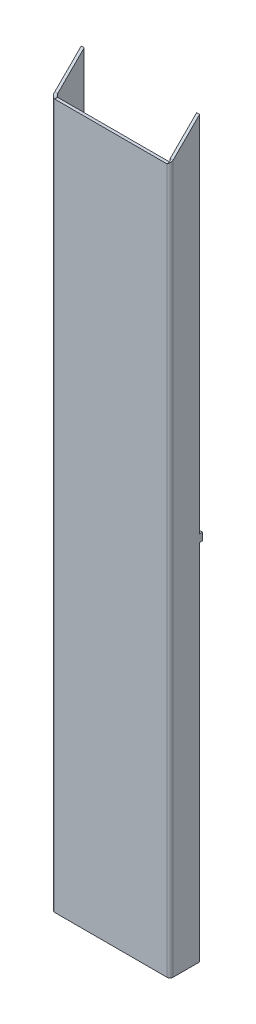
ISO-10303-21;
HEADER;
FILE_DESCRIPTION(('STEP AP214'),'2;1');
FILE_NAME('part.step','',(''),(''),'','','');
FILE_SCHEMA(('AUTOMOTIVE_DESIGN { 1 0 10303 214 1 1 1 1 }'));
ENDSEC;
DATA;
#1=APPLICATION_CONTEXT('core data for automotive mechanical design processes');
#2=APPLICATION_PROTOCOL_DEFINITION('international standard','automotive_design',2000,#1);
#3=PRODUCT_CONTEXT('',#1,'mechanical');
#4=PRODUCT('Part','Part','',(#3));
#5=PRODUCT_RELATED_PRODUCT_CATEGORY('part','',(#4));
#6=PRODUCT_DEFINITION_FORMATION('','',#4);
#7=PRODUCT_DEFINITION_CONTEXT('part definition',#1,'design');
#8=PRODUCT_DEFINITION('design','',#6,#7);
#9=PRODUCT_DEFINITION_SHAPE('','',#8);
#10=(LENGTH_UNIT() NAMED_UNIT(*) SI_UNIT(.MILLI.,.METRE.));
#11=(NAMED_UNIT(*) PLANE_ANGLE_UNIT() SI_UNIT($,.RADIAN.));
#12=(NAMED_UNIT(*) SI_UNIT($,.STERADIAN.) SOLID_ANGLE_UNIT());
#13=UNCERTAINTY_MEASURE_WITH_UNIT(LENGTH_MEASURE(1.E-05),#10,'distance_accuracy_value','');
#14=(GEOMETRIC_REPRESENTATION_CONTEXT(3) GLOBAL_UNCERTAINTY_ASSIGNED_CONTEXT((#13)) GLOBAL_UNIT_ASSIGNED_CONTEXT((#10,
#11,#12)) REPRESENTATION_CONTEXT('',''));
#15=CARTESIAN_POINT('',(0.,0.,0.));
#16=DIRECTION('',(0.,0.,1.));
#17=DIRECTION('',(1.,0.,0.));
#18=AXIS2_PLACEMENT_3D('',#15,#16,#17);
#19=CARTESIAN_POINT('',(1202.79808621894,247.5,-148.));
#20=DIRECTION('',(0.,-1.,0.));
#21=DIRECTION('',(1.,0.,0.));
#22=AXIS2_PLACEMENT_3D('',#19,#20,#21);
#23=PLANE('',#22);
#24=DIRECTION('',(-1.,0.,0.));
#25=VECTOR('',#24,1.);
#26=CARTESIAN_POINT('',(1202.79808621894,247.5,-148.));
#27=LINE('',#26,#25);
#28=CARTESIAN_POINT('',(212.,247.5,-148.));
#29=VERTEX_POINT('',#28);
#30=CARTESIAN_POINT('',(210.,247.5,-148.));
#31=VERTEX_POINT('',#30);
#32=EDGE_CURVE('E248',#29,#31,#27,.T.);
#33=ORIENTED_EDGE('',*,*,#32,.T.);
#34=DIRECTION('',(0.,0.,1.));
#35=VECTOR('',#34,1.);
#36=CARTESIAN_POINT('',(210.,247.5,-148.));
#37=LINE('',#36,#35);
#38=CARTESIAN_POINT('',(210.,247.5,-150.));
#39=VERTEX_POINT('',#38);
#40=EDGE_CURVE('E112',#39,#31,#37,.T.);
#41=ORIENTED_EDGE('',*,*,#40,.F.);
#42=DIRECTION('',(-1.,0.,0.));
#43=VECTOR('',#42,1.);
#44=CARTESIAN_POINT('',(1202.79808621894,247.5,-150.));
#45=LINE('',#44,#43);
#46=CARTESIAN_POINT('',(212.,247.5,-150.));
#47=VERTEX_POINT('',#46);
#48=EDGE_CURVE('E626',#47,#39,#45,.T.);
#49=ORIENTED_EDGE('',*,*,#48,.F.);
#50=DIRECTION('',(0.,0.,1.));
#51=VECTOR('',#50,1.);
#52=CARTESIAN_POINT('',(212.,247.5,-148.));
#53=LINE('',#52,#51);
#54=EDGE_CURVE('E107',#47,#29,#53,.T.);
#55=ORIENTED_EDGE('',*,*,#54,.T.);
#56=EDGE_LOOP('',(#33,#41,#49,#55));
#57=FACE_BOUND('',#56,.T.);
#58=ADVANCED_FACE('F45',(#57),#23,.T.);
#59=CARTESIAN_POINT('',(1202.79808621894,252.5,-150.));
#60=DIRECTION('',(0.,0.,-1.));
#61=DIRECTION('',(-1.,0.,0.));
#62=AXIS2_PLACEMENT_3D('',#59,#60,#61);
#63=PLANE('',#62);
#64=ORIENTED_EDGE('',*,*,#48,.T.);
#65=DIRECTION('',(0.,-1.,0.));
#66=VECTOR('',#65,1.);
#67=CARTESIAN_POINT('',(210.,252.5,-150.));
#68=LINE('',#67,#66);
#69=CARTESIAN_POINT('',(210.,252.5,-150.));
#70=VERTEX_POINT('',#69);
#71=EDGE_CURVE('E638',#70,#39,#68,.T.);
#72=ORIENTED_EDGE('',*,*,#71,.F.);
#73=DIRECTION('',(-1.,0.,0.));
#74=VECTOR('',#73,1.);
#75=CARTESIAN_POINT('',(1202.79808621894,252.5,-150.));
#76=LINE('',#75,#74);
#77=CARTESIAN_POINT('',(212.,252.5,-150.));
#78=VERTEX_POINT('',#77);
#79=EDGE_CURVE('E620',#78,#70,#76,.T.);
#80=ORIENTED_EDGE('',*,*,#79,.F.);
#81=DIRECTION('',(0.,-1.,0.));
#82=VECTOR('',#81,1.);
#83=CARTESIAN_POINT('',(212.,252.5,-150.));
#84=LINE('',#83,#82);
#85=EDGE_CURVE('E623',#78,#47,#84,.T.);
#86=ORIENTED_EDGE('',*,*,#85,.T.);
#87=EDGE_LOOP('',(#64,#72,#80,#86));
#88=FACE_BOUND('',#87,.T.);
#89=ADVANCED_FACE('F573',(#88),#63,.T.);
#90=CARTESIAN_POINT('',(1202.79808621894,252.5,-148.));
#91=DIRECTION('',(0.,1.,0.));
#92=DIRECTION('',(-1.,0.,0.));
#93=AXIS2_PLACEMENT_3D('',#90,#91,#92);
#94=PLANE('',#93);
#95=ORIENTED_EDGE('',*,*,#79,.T.);
#96=DIRECTION('',(0.,0.,-1.));
#97=VECTOR('',#96,1.);
#98=CARTESIAN_POINT('',(210.,252.5,-148.));
#99=LINE('',#98,#97);
#100=CARTESIAN_POINT('',(210.,252.5,-148.));
#101=VERTEX_POINT('',#100);
#102=EDGE_CURVE('E631',#101,#70,#99,.T.);
#103=ORIENTED_EDGE('',*,*,#102,.F.);
#104=DIRECTION('',(-1.,0.,0.));
#105=VECTOR('',#104,1.);
#106=CARTESIAN_POINT('',(1202.79808621894,252.5,-148.));
#107=LINE('',#106,#105);
#108=CARTESIAN_POINT('',(212.,252.5,-148.));
#109=VERTEX_POINT('',#108);
#110=EDGE_CURVE('E621',#109,#101,#107,.T.);
#111=ORIENTED_EDGE('',*,*,#110,.F.);
#112=DIRECTION('',(0.,0.,-1.));
#113=VECTOR('',#112,1.);
#114=CARTESIAN_POINT('',(212.,252.5,-148.));
#115=LINE('',#114,#113);
#116=EDGE_CURVE('E615',#109,#78,#115,.T.);
#117=ORIENTED_EDGE('',*,*,#116,.T.);
#118=EDGE_LOOP('',(#95,#103,#111,#117));
#119=FACE_BOUND('',#118,.T.);
#120=ADVANCED_FACE('F577',(#119),#94,.T.);
#121=CARTESIAN_POINT('',(1202.79808621894,2.,-148.));
#122=DIRECTION('',(0.,0.,1.));
#123=DIRECTION('',(1.,0.,0.));
#124=AXIS2_PLACEMENT_3D('',#121,#122,#123);
#125=PLANE('',#124);
#126=DIRECTION('',(0.,1.,0.));
#127=VECTOR('',#126,1.);
#128=CARTESIAN_POINT('',(210.,2.,-148.));
#129=LINE('',#128,#127);
#130=CARTESIAN_POINT('',(210.,498.,-148.));
#131=VERTEX_POINT('',#130);
#132=EDGE_CURVE('E619',#101,#131,#129,.T.);
#133=ORIENTED_EDGE('',*,*,#132,.T.);
#134=DIRECTION('',(-1.,0.,0.));
#135=VECTOR('',#134,1.);
#136=CARTESIAN_POINT('',(1202.79808621894,498.,-148.));
#137=LINE('',#136,#135);
#138=CARTESIAN_POINT('',(212.,498.,-148.));
#139=VERTEX_POINT('',#138);
#140=EDGE_CURVE('E226',#139,#131,#137,.T.);
#141=ORIENTED_EDGE('',*,*,#140,.F.);
#142=DIRECTION('',(0.,1.,0.));
#143=VECTOR('',#142,1.);
#144=CARTESIAN_POINT('',(212.,2.,-148.));
#145=LINE('',#144,#143);
#146=EDGE_CURVE('E55',#109,#139,#145,.T.);
#147=ORIENTED_EDGE('',*,*,#146,.F.);
#148=ORIENTED_EDGE('',*,*,#110,.T.);
#149=EDGE_LOOP('',(#133,#141,#147,#148));
#150=FACE_BOUND('',#149,.T.);
#151=ADVANCED_FACE('F583',(#150),#125,.F.);
#152=CARTESIAN_POINT('',(210.,2.,-148.));
#153=VERTEX_POINT('',#152);
#154=EDGE_CURVE('E222',#153,#31,#129,.T.);
#155=ORIENTED_EDGE('',*,*,#154,.T.);
#156=ORIENTED_EDGE('',*,*,#32,.F.);
#157=CARTESIAN_POINT('',(212.,2.,-148.));
#158=VERTEX_POINT('',#157);
#159=EDGE_CURVE('E283',#158,#29,#145,.T.);
#160=ORIENTED_EDGE('',*,*,#159,.F.);
#161=DIRECTION('',(-1.,0.,0.));
#162=VECTOR('',#161,1.);
#163=CARTESIAN_POINT('',(1202.79808621894,2.,-148.));
#164=LINE('',#163,#162);
#165=EDGE_CURVE('E237',#158,#153,#164,.T.);
#166=ORIENTED_EDGE('',*,*,#165,.T.);
#167=EDGE_LOOP('',(#155,#156,#160,#166));
#168=FACE_BOUND('',#167,.T.);
#169=ADVANCED_FACE('F585',(#168),#125,.F.);
#170=CARTESIAN_POINT('',(1202.79808621894,2.,-148.));
#171=DIRECTION('',(0.,1.,0.));
#172=DIRECTION('',(-1.,0.,0.));
#173=AXIS2_PLACEMENT_3D('',#170,#171,#172);
#174=PLANE('',#173);
#175=DIRECTION('',(0.,0.,1.));
#176=VECTOR('',#175,1.);
#177=CARTESIAN_POINT('',(210.,2.,-148.));
#178=LINE('',#177,#176);
#179=CARTESIAN_POINT('',(210.,2.,-130.1));
#180=VERTEX_POINT('',#179);
#181=EDGE_CURVE('E215',#153,#180,#178,.T.);
#182=ORIENTED_EDGE('',*,*,#181,.F.);
#183=ORIENTED_EDGE('',*,*,#165,.F.);
#184=DIRECTION('',(0.,0.,-1.));
#185=VECTOR('',#184,1.);
#186=CARTESIAN_POINT('',(212.,2.,-148.));
#187=LINE('',#186,#185);
#188=CARTESIAN_POINT('',(212.,2.,-130.1));
#189=VERTEX_POINT('',#188);
#190=EDGE_CURVE('E232',#189,#158,#187,.T.);
#191=ORIENTED_EDGE('',*,*,#190,.F.);
#192=DIRECTION('',(-1.,0.,0.));
#193=VECTOR('',#192,1.);
#194=CARTESIAN_POINT('',(1202.79808621894,2.,-130.1));
#195=LINE('',#194,#193);
#196=EDGE_CURVE('E229',#189,#180,#195,.T.);
#197=ORIENTED_EDGE('',*,*,#196,.T.);
#198=EDGE_LOOP('',(#182,#183,#191,#197));
#199=FACE_BOUND('',#198,.T.);
#200=ADVANCED_FACE('F230',(#199),#174,.F.);
#201=CARTESIAN_POINT('',(210.,2.,-148.));
#202=DIRECTION('',(-1.,0.,0.));
#203=DIRECTION('',(0.,0.,1.));
#204=AXIS2_PLACEMENT_3D('',#201,#202,#203);
#205=PLANE('',#204);
#206=DIRECTION('',(0.,-1.,0.));
#207=VECTOR('',#206,1.);
#208=CARTESIAN_POINT('',(210.,2.,-130.1));
#209=LINE('',#208,#207);
#210=CARTESIAN_POINT('',(210.,480.1,-130.1));
#211=VERTEX_POINT('',#210);
#212=EDGE_CURVE('E220',#211,#180,#209,.T.);
#213=ORIENTED_EDGE('',*,*,#212,.F.);
#214=DIRECTION('',(0.,0.707106781186548,-0.707106781186548));
#215=VECTOR('',#214,1.);
#216=CARTESIAN_POINT('',(210.,250.,100.));
#217=LINE('',#216,#215);
#218=EDGE_CURVE('E236',#211,#131,#217,.T.);
#219=ORIENTED_EDGE('',*,*,#218,.T.);
#220=ORIENTED_EDGE('',*,*,#132,.F.);
#221=ORIENTED_EDGE('',*,*,#102,.T.);
#222=ORIENTED_EDGE('',*,*,#71,.T.);
#223=ORIENTED_EDGE('',*,*,#40,.T.);
#224=ORIENTED_EDGE('',*,*,#154,.F.);
#225=ORIENTED_EDGE('',*,*,#181,.T.);
#226=EDGE_LOOP('',(#213,#219,#220,#221,#222,#223,#224,#225));
#227=FACE_BOUND('',#226,.T.);
#228=ADVANCED_FACE('F217',(#227),#205,.T.);
#229=CARTESIAN_POINT('',(1202.79808621894,250.,100.));
#230=DIRECTION('',(0.,-0.707106781186548,-0.707106781186548));
#231=DIRECTION('',(0.,-0.707106781186548,0.707106781186548));
#232=AXIS2_PLACEMENT_3D('',#229,#230,#231);
#233=PLANE('',#232);
#234=ORIENTED_EDGE('',*,*,#218,.F.);
#235=CARTESIAN_POINT('',(212.,480.1,-130.1));
#236=CARTESIAN_POINT('',(210.,480.1,-130.1));
#237=B_SPLINE_CURVE_WITH_KNOTS('',1,(#235,#236),.UNSPECIFIED.,.F.,.F.,(2,2),(0.,1.),.UNSPECIFIED.);
#238=CARTESIAN_POINT('',(212.,480.1,-130.1));
#239=VERTEX_POINT('',#238);
#240=EDGE_CURVE('E249',#239,#211,#237,.T.);
#241=ORIENTED_EDGE('',*,*,#240,.F.);
#242=DIRECTION('',(0.,-0.707106781186548,0.707106781186548));
#243=VECTOR('',#242,1.);
#244=CARTESIAN_POINT('',(212.,250.,100.));
#245=LINE('',#244,#243);
#246=EDGE_CURVE('E12',#139,#239,#245,.T.);
#247=ORIENTED_EDGE('',*,*,#246,.F.);
#248=ORIENTED_EDGE('',*,*,#140,.T.);
#249=EDGE_LOOP('',(#234,#241,#247,#248));
#250=FACE_BOUND('',#249,.T.);
#251=ADVANCED_FACE('F592',(#250),#233,.F.);
#252=CARTESIAN_POINT('',(212.,2.,-148.));
#253=DIRECTION('',(1.,0.,0.));
#254=DIRECTION('',(0.,0.,-1.));
#255=AXIS2_PLACEMENT_3D('',#252,#253,#254);
#256=PLANE('',#255);
#257=DIRECTION('',(0.,1.,0.));
#258=VECTOR('',#257,1.);
#259=CARTESIAN_POINT('',(212.,2.,-130.1));
#260=LINE('',#259,#258);
#261=EDGE_CURVE('E395',#189,#239,#260,.T.);
#262=ORIENTED_EDGE('',*,*,#261,.F.);
#263=ORIENTED_EDGE('',*,*,#190,.T.);
#264=ORIENTED_EDGE('',*,*,#159,.T.);
#265=ORIENTED_EDGE('',*,*,#54,.F.);
#266=ORIENTED_EDGE('',*,*,#85,.F.);
#267=ORIENTED_EDGE('',*,*,#116,.F.);
#268=ORIENTED_EDGE('',*,*,#146,.T.);
#269=ORIENTED_EDGE('',*,*,#246,.T.);
#270=EDGE_LOOP('',(#262,#263,#264,#265,#266,#267,#268,#269));
#271=FACE_BOUND('',#270,.T.);
#272=ADVANCED_FACE('F47',(#271),#256,.T.);
#273=CARTESIAN_POINT('',(-702.798086218945,252.5,-148.));
#274=DIRECTION('',(0.,1.,0.));
#275=DIRECTION('',(1.,0.,0.));
#276=AXIS2_PLACEMENT_3D('',#273,#274,#275);
#277=PLANE('',#276);
#278=DIRECTION('',(1.,0.,0.));
#279=VECTOR('',#278,1.);
#280=CARTESIAN_POINT('',(-702.798086218945,252.5,-148.));
#281=LINE('',#280,#279);
#282=CARTESIAN_POINT('',(288.,252.5,-148.));
#283=VERTEX_POINT('',#282);
#284=CARTESIAN_POINT('',(290.,252.5,-148.));
#285=VERTEX_POINT('',#284);
#286=EDGE_CURVE('E434',#283,#285,#281,.T.);
#287=ORIENTED_EDGE('',*,*,#286,.T.);
#288=DIRECTION('',(0.,0.,1.));
#289=VECTOR('',#288,1.);
#290=CARTESIAN_POINT('',(290.,252.5,-148.));
#291=LINE('',#290,#289);
#292=CARTESIAN_POINT('',(290.,252.5,-150.));
#293=VERTEX_POINT('',#292);
#294=EDGE_CURVE('E170',#293,#285,#291,.T.);
#295=ORIENTED_EDGE('',*,*,#294,.F.);
#296=DIRECTION('',(1.,0.,0.));
#297=VECTOR('',#296,1.);
#298=CARTESIAN_POINT('',(-702.798086218945,252.5,-150.));
#299=LINE('',#298,#297);
#300=CARTESIAN_POINT('',(288.,252.5,-150.));
#301=VERTEX_POINT('',#300);
#302=EDGE_CURVE('E430',#301,#293,#299,.T.);
#303=ORIENTED_EDGE('',*,*,#302,.F.);
#304=DIRECTION('',(0.,0.,1.));
#305=VECTOR('',#304,1.);
#306=CARTESIAN_POINT('',(288.,252.5,-148.));
#307=LINE('',#306,#305);
#308=EDGE_CURVE('E166',#301,#283,#307,.T.);
#309=ORIENTED_EDGE('',*,*,#308,.T.);
#310=EDGE_LOOP('',(#287,#295,#303,#309));
#311=FACE_BOUND('',#310,.T.);
#312=ADVANCED_FACE('F832',(#311),#277,.T.);
#313=CARTESIAN_POINT('',(-702.798086218945,252.5,-150.));
#314=DIRECTION('',(0.,0.,-1.));
#315=DIRECTION('',(-1.,0.,0.));
#316=AXIS2_PLACEMENT_3D('',#313,#314,#315);
#317=PLANE('',#316);
#318=ORIENTED_EDGE('',*,*,#302,.T.);
#319=DIRECTION('',(0.,1.,0.));
#320=VECTOR('',#319,1.);
#321=CARTESIAN_POINT('',(290.,252.5,-150.));
#322=LINE('',#321,#320);
#323=CARTESIAN_POINT('',(290.,247.5,-150.));
#324=VERTEX_POINT('',#323);
#325=EDGE_CURVE('E402',#324,#293,#322,.T.);
#326=ORIENTED_EDGE('',*,*,#325,.F.);
#327=DIRECTION('',(1.,0.,0.));
#328=VECTOR('',#327,1.);
#329=CARTESIAN_POINT('',(-702.798086218945,247.5,-150.));
#330=LINE('',#329,#328);
#331=CARTESIAN_POINT('',(288.,247.5,-150.));
#332=VERTEX_POINT('',#331);
#333=EDGE_CURVE('E419',#332,#324,#330,.T.);
#334=ORIENTED_EDGE('',*,*,#333,.F.);
#335=DIRECTION('',(0.,1.,0.));
#336=VECTOR('',#335,1.);
#337=CARTESIAN_POINT('',(288.,252.5,-150.));
#338=LINE('',#337,#336);
#339=EDGE_CURVE('E427',#332,#301,#338,.T.);
#340=ORIENTED_EDGE('',*,*,#339,.T.);
#341=EDGE_LOOP('',(#318,#326,#334,#340));
#342=FACE_BOUND('',#341,.T.);
#343=ADVANCED_FACE('F823',(#342),#317,.T.);
#344=CARTESIAN_POINT('',(-702.798086218945,247.5,-148.));
#345=DIRECTION('',(0.,-1.,0.));
#346=DIRECTION('',(-1.,0.,0.));
#347=AXIS2_PLACEMENT_3D('',#344,#345,#346);
#348=PLANE('',#347);
#349=ORIENTED_EDGE('',*,*,#333,.T.);
#350=DIRECTION('',(0.,0.,-1.));
#351=VECTOR('',#350,1.);
#352=CARTESIAN_POINT('',(290.,247.5,-148.));
#353=LINE('',#352,#351);
#354=CARTESIAN_POINT('',(290.,247.5,-148.));
#355=VERTEX_POINT('',#354);
#356=EDGE_CURVE('E372',#355,#324,#353,.T.);
#357=ORIENTED_EDGE('',*,*,#356,.F.);
#358=DIRECTION('',(1.,0.,0.));
#359=VECTOR('',#358,1.);
#360=CARTESIAN_POINT('',(-702.798086218945,247.5,-148.));
#361=LINE('',#360,#359);
#362=CARTESIAN_POINT('',(288.,247.5,-148.));
#363=VERTEX_POINT('',#362);
#364=EDGE_CURVE('E416',#363,#355,#361,.T.);
#365=ORIENTED_EDGE('',*,*,#364,.F.);
#366=DIRECTION('',(0.,0.,-1.));
#367=VECTOR('',#366,1.);
#368=CARTESIAN_POINT('',(288.,247.5,-148.));
#369=LINE('',#368,#367);
#370=EDGE_CURVE('E423',#363,#332,#369,.T.);
#371=ORIENTED_EDGE('',*,*,#370,.T.);
#372=EDGE_LOOP('',(#349,#357,#365,#371));
#373=FACE_BOUND('',#372,.T.);
#374=ADVANCED_FACE('F415',(#373),#348,.T.);
#375=CARTESIAN_POINT('',(-702.798086218945,2.,-148.));
#376=DIRECTION('',(0.,0.,-1.));
#377=DIRECTION('',(-1.,0.,0.));
#378=AXIS2_PLACEMENT_3D('',#375,#376,#377);
#379=PLANE('',#378);
#380=ORIENTED_EDGE('',*,*,#364,.T.);
#381=DIRECTION('',(0.,1.,0.));
#382=VECTOR('',#381,1.);
#383=CARTESIAN_POINT('',(290.,2.,-148.));
#384=LINE('',#383,#382);
#385=CARTESIAN_POINT('',(290.,2.,-148.));
#386=VERTEX_POINT('',#385);
#387=EDGE_CURVE('E370',#386,#355,#384,.T.);
#388=ORIENTED_EDGE('',*,*,#387,.F.);
#389=DIRECTION('',(1.,0.,0.));
#390=VECTOR('',#389,1.);
#391=CARTESIAN_POINT('',(-702.798086218945,2.,-148.));
#392=LINE('',#391,#390);
#393=CARTESIAN_POINT('',(288.,2.,-148.));
#394=VERTEX_POINT('',#393);
#395=EDGE_CURVE('E337',#394,#386,#392,.T.);
#396=ORIENTED_EDGE('',*,*,#395,.F.);
#397=DIRECTION('',(0.,1.,0.));
#398=VECTOR('',#397,1.);
#399=CARTESIAN_POINT('',(288.,2.,-148.));
#400=LINE('',#399,#398);
#401=EDGE_CURVE('E379',#394,#363,#400,.T.);
#402=ORIENTED_EDGE('',*,*,#401,.T.);
#403=EDGE_LOOP('',(#380,#388,#396,#402));
#404=FACE_BOUND('',#403,.T.);
#405=ADVANCED_FACE('F421',(#404),#379,.T.);
#406=DIRECTION('',(1.,0.,0.));
#407=VECTOR('',#406,1.);
#408=CARTESIAN_POINT('',(-702.798086218945,498.,-148.));
#409=LINE('',#408,#407);
#410=CARTESIAN_POINT('',(288.,498.,-148.));
#411=VERTEX_POINT('',#410);
#412=CARTESIAN_POINT('',(290.,498.,-148.));
#413=VERTEX_POINT('',#412);
#414=EDGE_CURVE('E378',#411,#413,#409,.T.);
#415=ORIENTED_EDGE('',*,*,#414,.T.);
#416=EDGE_CURVE('E338',#285,#413,#384,.T.);
#417=ORIENTED_EDGE('',*,*,#416,.F.);
#418=ORIENTED_EDGE('',*,*,#286,.F.);
#419=EDGE_CURVE('E375',#283,#411,#400,.T.);
#420=ORIENTED_EDGE('',*,*,#419,.T.);
#421=EDGE_LOOP('',(#415,#417,#418,#420));
#422=FACE_BOUND('',#421,.T.);
#423=ADVANCED_FACE('F798',(#422),#379,.T.);
#424=CARTESIAN_POINT('',(-702.798086218945,241.,109.));
#425=DIRECTION('',(0.,-0.707106781186548,-0.707106781186548));
#426=DIRECTION('',(0.,0.707106781186548,-0.707106781186548));
#427=AXIS2_PLACEMENT_3D('',#424,#425,#426);
#428=PLANE('',#427);
#429=DIRECTION('',(0.,-0.707106781186548,0.707106781186548));
#430=VECTOR('',#429,1.);
#431=CARTESIAN_POINT('',(290.,240.,110.));
#432=LINE('',#431,#430);
#433=CARTESIAN_POINT('',(290.,480.1,-130.1));
#434=VERTEX_POINT('',#433);
#435=EDGE_CURVE('E334',#413,#434,#432,.T.);
#436=ORIENTED_EDGE('',*,*,#435,.F.);
#437=ORIENTED_EDGE('',*,*,#414,.F.);
#438=DIRECTION('',(0.,0.707106781186548,-0.707106781186548));
#439=VECTOR('',#438,1.);
#440=CARTESIAN_POINT('',(288.,241.,109.));
#441=LINE('',#440,#439);
#442=CARTESIAN_POINT('',(288.,480.1,-130.1));
#443=VERTEX_POINT('',#442);
#444=EDGE_CURVE('E341',#443,#411,#441,.T.);
#445=ORIENTED_EDGE('',*,*,#444,.F.);
#446=CARTESIAN_POINT('',(290.,480.1,-130.099999999999));
#447=CARTESIAN_POINT('',(288.,480.1,-130.1));
#448=B_SPLINE_CURVE_WITH_KNOTS('',1,(#446,#447),.UNSPECIFIED.,.F.,.F.,(2,2),(0.,1.),.UNSPECIFIED.);
#449=EDGE_CURVE('E371',#443,#434,#448,.F.);
#450=ORIENTED_EDGE('',*,*,#449,.T.);
#451=EDGE_LOOP('',(#436,#437,#445,#450));
#452=FACE_BOUND('',#451,.T.);
#453=ADVANCED_FACE('F556',(#452),#428,.F.);
#454=CARTESIAN_POINT('',(290.,2.,-128.));
#455=DIRECTION('',(1.,0.,0.));
#456=DIRECTION('',(0.,0.,-1.));
#457=AXIS2_PLACEMENT_3D('',#454,#455,#456);
#458=PLANE('',#457);
#459=DIRECTION('',(0.,1.,0.));
#460=VECTOR('',#459,1.);
#461=CARTESIAN_POINT('',(290.,480.1,-130.1));
#462=LINE('',#461,#460);
#463=CARTESIAN_POINT('',(290.,2.,-130.1));
#464=VERTEX_POINT('',#463);
#465=EDGE_CURVE('E332',#464,#434,#462,.T.);
#466=ORIENTED_EDGE('',*,*,#465,.F.);
#467=DIRECTION('',(0.,0.,-1.));
#468=VECTOR('',#467,1.);
#469=CARTESIAN_POINT('',(290.,2.,-130.));
#470=LINE('',#469,#468);
#471=EDGE_CURVE('E365',#464,#386,#470,.T.);
#472=ORIENTED_EDGE('',*,*,#471,.T.);
#473=ORIENTED_EDGE('',*,*,#387,.T.);
#474=ORIENTED_EDGE('',*,*,#356,.T.);
#475=ORIENTED_EDGE('',*,*,#325,.T.);
#476=ORIENTED_EDGE('',*,*,#294,.T.);
#477=ORIENTED_EDGE('',*,*,#416,.T.);
#478=ORIENTED_EDGE('',*,*,#435,.T.);
#479=EDGE_LOOP('',(#466,#472,#473,#474,#475,#476,#477,#478));
#480=FACE_BOUND('',#479,.T.);
#481=ADVANCED_FACE('F409',(#480),#458,.T.);
#482=CARTESIAN_POINT('',(-702.798086218945,2.,-130.));
#483=DIRECTION('',(0.,1.,0.));
#484=DIRECTION('',(1.,0.,0.));
#485=AXIS2_PLACEMENT_3D('',#482,#483,#484);
#486=PLANE('',#485);
#487=ORIENTED_EDGE('',*,*,#471,.F.);
#488=DIRECTION('',(1.,0.,0.));
#489=VECTOR('',#488,1.);
#490=CARTESIAN_POINT('',(-702.798086218945,2.,-130.1));
#491=LINE('',#490,#489);
#492=CARTESIAN_POINT('',(288.,2.,-130.1));
#493=VERTEX_POINT('',#492);
#494=EDGE_CURVE('E435',#493,#464,#491,.T.);
#495=ORIENTED_EDGE('',*,*,#494,.F.);
#496=DIRECTION('',(0.,0.,1.));
#497=VECTOR('',#496,1.);
#498=CARTESIAN_POINT('',(288.,2.,-130.));
#499=LINE('',#498,#497);
#500=EDGE_CURVE('E121',#394,#493,#499,.T.);
#501=ORIENTED_EDGE('',*,*,#500,.F.);
#502=ORIENTED_EDGE('',*,*,#395,.T.);
#503=EDGE_LOOP('',(#487,#495,#501,#502));
#504=FACE_BOUND('',#503,.T.);
#505=ADVANCED_FACE('F563',(#504),#486,.F.);
#506=CARTESIAN_POINT('',(288.,2.,-130.));
#507=DIRECTION('',(-1.,0.,0.));
#508=DIRECTION('',(0.,0.,1.));
#509=AXIS2_PLACEMENT_3D('',#506,#507,#508);
#510=PLANE('',#509);
#511=DIRECTION('',(0.,-1.,0.));
#512=VECTOR('',#511,1.);
#513=CARTESIAN_POINT('',(288.,480.1,-130.1));
#514=LINE('',#513,#512);
#515=EDGE_CURVE('E315',#443,#493,#514,.T.);
#516=ORIENTED_EDGE('',*,*,#515,.F.);
#517=ORIENTED_EDGE('',*,*,#444,.T.);
#518=ORIENTED_EDGE('',*,*,#419,.F.);
#519=ORIENTED_EDGE('',*,*,#308,.F.);
#520=ORIENTED_EDGE('',*,*,#339,.F.);
#521=ORIENTED_EDGE('',*,*,#370,.F.);
#522=ORIENTED_EDGE('',*,*,#401,.F.);
#523=ORIENTED_EDGE('',*,*,#500,.T.);
#524=EDGE_LOOP('',(#516,#517,#518,#519,#520,#521,#522,#523));
#525=FACE_BOUND('',#524,.T.);
#526=ADVANCED_FACE('F561',(#525),#510,.T.);
#527=CARTESIAN_POINT('',(212.,2.,-1091.99510372201));
#528=DIRECTION('',(0.,1.,0.));
#529=DIRECTION('',(0.,0.,1.));
#530=AXIS2_PLACEMENT_3D('',#527,#528,#529);
#531=PLANE('',#530);
#532=DIRECTION('',(1.,0.,0.));
#533=VECTOR('',#532,1.);
#534=CARTESIAN_POINT('',(210.,2.,-128.));
#535=LINE('',#534,#533);
#536=CARTESIAN_POINT('',(212.1,2.,-128.));
#537=VERTEX_POINT('',#536);
#538=CARTESIAN_POINT('',(287.9,2.,-128.));
#539=VERTEX_POINT('',#538);
#540=EDGE_CURVE('E477',#537,#539,#535,.T.);
#541=ORIENTED_EDGE('',*,*,#540,.F.);
#542=DIRECTION('',(0.,0.,1.));
#543=VECTOR('',#542,1.);
#544=CARTESIAN_POINT('',(212.1,2.,-1091.99510372201));
#545=LINE('',#544,#543);
#546=CARTESIAN_POINT('',(212.1,2.,-130.));
#547=VERTEX_POINT('',#546);
#548=EDGE_CURVE('E253',#547,#537,#545,.T.);
#549=ORIENTED_EDGE('',*,*,#548,.F.);
#550=DIRECTION('',(-1.,0.,0.));
#551=VECTOR('',#550,1.);
#552=CARTESIAN_POINT('',(212.,2.,-130.));
#553=LINE('',#552,#551);
#554=CARTESIAN_POINT('',(287.9,2.,-130.));
#555=VERTEX_POINT('',#554);
#556=EDGE_CURVE('E465',#555,#547,#553,.T.);
#557=ORIENTED_EDGE('',*,*,#556,.F.);
#558=DIRECTION('',(0.,0.,1.));
#559=VECTOR('',#558,1.);
#560=CARTESIAN_POINT('',(287.9,2.,-1091.99510372201));
#561=LINE('',#560,#559);
#562=EDGE_CURVE('E470',#555,#539,#561,.T.);
#563=ORIENTED_EDGE('',*,*,#562,.T.);
#564=EDGE_LOOP('',(#541,#549,#557,#563));
#565=FACE_BOUND('',#564,.T.);
#566=ADVANCED_FACE('F297',(#565),#531,.F.);
#567=CARTESIAN_POINT('',(210.,478.,-1091.99510372201));
#568=DIRECTION('',(0.,1.,0.));
#569=DIRECTION('',(0.,0.,1.));
#570=AXIS2_PLACEMENT_3D('',#567,#568,#569);
#571=PLANE('',#570);
#572=CARTESIAN_POINT('',(212.1,478.,-128.));
#573=CARTESIAN_POINT('',(212.1,478.,-130.));
#574=B_SPLINE_CURVE_WITH_KNOTS('',1,(#572,#573),.UNSPECIFIED.,.F.,.F.,(2,2),(0.,1.),.UNSPECIFIED.);
#575=CARTESIAN_POINT('',(212.1,478.,-130.));
#576=VERTEX_POINT('',#575);
#577=CARTESIAN_POINT('',(212.1,478.,-128.));
#578=VERTEX_POINT('',#577);
#579=EDGE_CURVE('E277',#576,#578,#574,.F.);
#580=ORIENTED_EDGE('',*,*,#579,.T.);
#581=DIRECTION('',(-1.,0.,0.));
#582=VECTOR('',#581,1.);
#583=CARTESIAN_POINT('',(210.,478.,-128.));
#584=LINE('',#583,#582);
#585=CARTESIAN_POINT('',(287.9,478.,-128.));
#586=VERTEX_POINT('',#585);
#587=EDGE_CURVE('E319',#586,#578,#584,.T.);
#588=ORIENTED_EDGE('',*,*,#587,.F.);
#589=CARTESIAN_POINT('',(287.9,478.,-130.));
#590=CARTESIAN_POINT('',(287.9,478.,-128.));
#591=B_SPLINE_CURVE_WITH_KNOTS('',1,(#589,#590),.UNSPECIFIED.,.F.,.F.,(2,2),(0.,1.),.UNSPECIFIED.);
#592=CARTESIAN_POINT('',(287.9,478.,-130.));
#593=VERTEX_POINT('',#592);
#594=EDGE_CURVE('E484',#593,#586,#591,.T.);
#595=ORIENTED_EDGE('',*,*,#594,.F.);
#596=DIRECTION('',(-1.,0.,0.));
#597=VECTOR('',#596,1.);
#598=CARTESIAN_POINT('',(210.,478.,-130.));
#599=LINE('',#598,#597);
#600=EDGE_CURVE('E462',#593,#576,#599,.T.);
#601=ORIENTED_EDGE('',*,*,#600,.T.);
#602=EDGE_LOOP('',(#580,#588,#595,#601));
#603=FACE_BOUND('',#602,.T.);
#604=ADVANCED_FACE('F286',(#603),#571,.T.);
#605=CARTESIAN_POINT('',(212.,2.,-130.));
#606=DIRECTION('',(0.,0.,-1.));
#607=DIRECTION('',(-1.,0.,0.));
#608=AXIS2_PLACEMENT_3D('',#605,#606,#607);
#609=PLANE('',#608);
#610=ORIENTED_EDGE('',*,*,#556,.T.);
#611=DIRECTION('',(0.,1.,0.));
#612=VECTOR('',#611,1.);
#613=CARTESIAN_POINT('',(212.1,2.,-130.));
#614=LINE('',#613,#612);
#615=EDGE_CURVE('E464',#547,#576,#614,.T.);
#616=ORIENTED_EDGE('',*,*,#615,.T.);
#617=ORIENTED_EDGE('',*,*,#600,.F.);
#618=DIRECTION('',(0.,-1.,0.));
#619=VECTOR('',#618,1.);
#620=CARTESIAN_POINT('',(287.9,478.,-130.));
#621=LINE('',#620,#619);
#622=EDGE_CURVE('E316',#593,#555,#621,.T.);
#623=ORIENTED_EDGE('',*,*,#622,.T.);
#624=EDGE_LOOP('',(#610,#616,#617,#623));
#625=FACE_BOUND('',#624,.T.);
#626=ADVANCED_FACE('F296',(#625),#609,.T.);
#627=CARTESIAN_POINT('',(210.,2.,-128.));
#628=DIRECTION('',(0.,0.,1.));
#629=DIRECTION('',(1.,0.,0.));
#630=AXIS2_PLACEMENT_3D('',#627,#628,#629);
#631=PLANE('',#630);
#632=ORIENTED_EDGE('',*,*,#587,.T.);
#633=DIRECTION('',(0.,-1.,0.));
#634=VECTOR('',#633,1.);
#635=CARTESIAN_POINT('',(212.1,2.,-128.));
#636=LINE('',#635,#634);
#637=EDGE_CURVE('E269',#578,#537,#636,.T.);
#638=ORIENTED_EDGE('',*,*,#637,.T.);
#639=ORIENTED_EDGE('',*,*,#540,.T.);
#640=DIRECTION('',(0.,1.,0.));
#641=VECTOR('',#640,1.);
#642=CARTESIAN_POINT('',(287.9,478.,-128.));
#643=LINE('',#642,#641);
#644=EDGE_CURVE('E307',#539,#586,#643,.T.);
#645=ORIENTED_EDGE('',*,*,#644,.T.);
#646=EDGE_LOOP('',(#632,#638,#639,#645));
#647=FACE_BOUND('',#646,.T.);
#648=ADVANCED_FACE('F504',(#647),#631,.T.);
#649=CARTESIAN_POINT('',(287.9,2.,-130.1));
#650=DIRECTION('',(0.,-1.,0.));
#651=DIRECTION('',(0.,0.,-1.));
#652=AXIS2_PLACEMENT_3D('',#649,#650,#651);
#653=PLANE('',#652);
#654=ORIENTED_EDGE('',*,*,#562,.F.);
#655=CARTESIAN_POINT('',(287.9,2.,-130.1));
#656=DIRECTION('',(0.,-1.,0.));
#657=DIRECTION('',(0.,0.,-1.));
#658=AXIS2_PLACEMENT_3D('',#655,#656,#657);
#659=CIRCLE('',#658,0.0999999999999832);
#660=EDGE_CURVE('E187',#555,#493,#659,.F.);
#661=ORIENTED_EDGE('',*,*,#660,.T.);
#662=ORIENTED_EDGE('',*,*,#494,.T.);
#663=CARTESIAN_POINT('',(287.9,2.,-130.1));
#664=DIRECTION('',(0.,-1.,0.));
#665=DIRECTION('',(0.,0.,-1.));
#666=AXIS2_PLACEMENT_3D('',#663,#664,#665);
#667=CIRCLE('',#666,2.09999999999998);
#668=EDGE_CURVE('E499',#539,#464,#667,.F.);
#669=ORIENTED_EDGE('',*,*,#668,.F.);
#670=EDGE_LOOP('',(#654,#661,#662,#669));
#671=FACE_BOUND('',#670,.T.);
#672=ADVANCED_FACE('F511',(#671),#653,.T.);
#673=CARTESIAN_POINT('',(290.,480.1,-130.099999999999));
#674=CARTESIAN_POINT('',(290.,479.924977547594,-129.825075374653));
#675=CARTESIAN_POINT('',(289.945342621003,479.75,-129.550329442845));
#676=CARTESIAN_POINT('',(289.734951415544,479.4,-129.042400141221));
#677=CARTESIAN_POINT('',(289.579300369036,479.225,-128.809451888052));
#678=CARTESIAN_POINT('',(289.190548111947,478.875,-128.420699630963));
#679=CARTESIAN_POINT('',(288.957599858778,478.7,-128.265048584456));
#680=CARTESIAN_POINT('',(288.449670557154,478.35,-128.054657378996));
#681=CARTESIAN_POINT('',(288.174924625346,478.175022452406,-128.));
#682=CARTESIAN_POINT('',(287.9,478.,-128.));
#683=CARTESIAN_POINT('',(288.,480.1,-130.1));
#684=CARTESIAN_POINT('',(288.,479.924999824448,-130.086910017479));
#685=CARTESIAN_POINT('',(287.997397267667,479.75,-130.073825211564));
#686=CARTESIAN_POINT('',(287.987378638835,479.4,-130.049638101963));
#687=CARTESIAN_POINT('',(287.97996668424,479.225,-130.038545328002));
#688=CARTESIAN_POINT('',(287.961454671997,478.875,-130.02003331576));
#689=CARTESIAN_POINT('',(287.950361898037,478.7,-130.012621361165));
#690=CARTESIAN_POINT('',(287.926174788436,478.35,-130.002602732333));
#691=CARTESIAN_POINT('',(287.913089982521,478.175000175552,-130.));
#692=CARTESIAN_POINT('',(287.9,478.,-130.));
#693=B_SPLINE_SURFACE_WITH_KNOTS('',1,3,((#673,#674,#675,#676,#677,#678,#679,#680,#681,#682),
(#683,#684,#685,#686,#687,#688,#689,#690,#691,#692)),.UNSPECIFIED.,.F.,.F.,.F.,(2,2),(4,2,2,2,
4),(0.,1.),(0.,0.25,0.5,0.75,1.),.UNSPECIFIED.);
#694=CARTESIAN_POINT('',(288.,480.1,-130.1));
#695=CARTESIAN_POINT('',(288.,479.924999824448,-130.086910017479));
#696=CARTESIAN_POINT('',(287.997397267667,479.75,-130.073825211564));
#697=CARTESIAN_POINT('',(287.987378638835,479.4,-130.049638101963));
#698=CARTESIAN_POINT('',(287.97996668424,479.225,-130.038545328002));
#699=CARTESIAN_POINT('',(287.961454671997,478.875,-130.02003331576));
#700=CARTESIAN_POINT('',(287.950361898037,478.7,-130.012621361165));
#701=CARTESIAN_POINT('',(287.926174788436,478.35,-130.002602732333));
#702=CARTESIAN_POINT('',(287.913089982521,478.175000175552,-130.));
#703=CARTESIAN_POINT('',(287.9,478.,-130.));
#704=B_SPLINE_CURVE_WITH_KNOTS('',3,(#694,#695,#696,#697,#698,#699,#700,#701,#702,#703),
.UNSPECIFIED.,.F.,.F.,(4,2,2,2,4),(0.,0.25,0.5,0.75,1.),.UNSPECIFIED.);
#705=EDGE_CURVE('E255',#443,#593,#704,.T.);
#706=CARTESIAN_POINT('',(287.9,478.,-128.));
#707=CARTESIAN_POINT('',(288.174924625346,478.175022452406,-128.));
#708=CARTESIAN_POINT('',(288.449670557154,478.35,-128.054657378996));
#709=CARTESIAN_POINT('',(288.957599858778,478.7,-128.265048584456));
#710=CARTESIAN_POINT('',(289.190548111947,478.875,-128.420699630963));
#711=CARTESIAN_POINT('',(289.579300369036,479.225,-128.809451888052));
#712=CARTESIAN_POINT('',(289.734951415544,479.4,-129.042400141221));
#713=CARTESIAN_POINT('',(289.945342621003,479.75,-129.550329442845));
#714=CARTESIAN_POINT('',(290.,479.924977547594,-129.825075374653));
#715=CARTESIAN_POINT('',(290.,480.1,-130.099999999999));
#716=B_SPLINE_CURVE_WITH_KNOTS('',3,(#706,#707,#708,#709,#710,#711,#712,#713,#714,#715),
.UNSPECIFIED.,.F.,.F.,(4,2,2,2,4),(0.,0.25,0.5,0.75,1.),.UNSPECIFIED.);
#717=EDGE_CURVE('E491',#434,#586,#716,.F.);
#718=ORIENTED_EDGE('',*,*,#449,.F.);
#719=ORIENTED_EDGE('',*,*,#705,.T.);
#720=ORIENTED_EDGE('',*,*,#594,.T.);
#721=ORIENTED_EDGE('',*,*,#717,.F.);
#722=EDGE_LOOP('',(#718,#719,#720,#721));
#723=FACE_BOUND('',#722,.T.);
#724=ADVANCED_FACE('F490',(#723),#693,.T.);
#725=CARTESIAN_POINT('',(287.9,989.662476546979,-130.1));
#726=DIRECTION('',(0.,-1.,0.));
#727=DIRECTION('',(0.,0.,-1.));
#728=AXIS2_PLACEMENT_3D('',#725,#726,#727);
#729=CYLINDRICAL_SURFACE('',#728,2.09999999999998);
#730=ORIENTED_EDGE('',*,*,#717,.T.);
#731=ORIENTED_EDGE('',*,*,#644,.F.);
#732=ORIENTED_EDGE('',*,*,#668,.T.);
#733=ORIENTED_EDGE('',*,*,#465,.T.);
#734=EDGE_LOOP('',(#730,#731,#732,#733));
#735=FACE_BOUND('',#734,.T.);
#736=ADVANCED_FACE('F498',(#735),#729,.T.);
#737=CARTESIAN_POINT('',(287.9,989.662476546979,-130.1));
#738=DIRECTION('',(0.,-1.,0.));
#739=DIRECTION('',(0.,0.,-1.));
#740=AXIS2_PLACEMENT_3D('',#737,#738,#739);
#741=CYLINDRICAL_SURFACE('',#740,0.0999999999999832);
#742=ORIENTED_EDGE('',*,*,#705,.F.);
#743=ORIENTED_EDGE('',*,*,#515,.T.);
#744=ORIENTED_EDGE('',*,*,#660,.F.);
#745=ORIENTED_EDGE('',*,*,#622,.F.);
#746=EDGE_LOOP('',(#742,#743,#744,#745));
#747=FACE_BOUND('',#746,.T.);
#748=ADVANCED_FACE('F513',(#747),#741,.F.);
#749=CARTESIAN_POINT('',(212.1,478.,-128.));
#750=CARTESIAN_POINT('',(211.825075374654,478.175022452406,-128.));
#751=CARTESIAN_POINT('',(211.550329442845,478.35,-128.054657378997));
#752=CARTESIAN_POINT('',(211.042400141221,478.7,-128.265048584456));
#753=CARTESIAN_POINT('',(210.809451888052,478.875,-128.420699630964));
#754=CARTESIAN_POINT('',(210.420699630964,479.225,-128.809451888053));
#755=CARTESIAN_POINT('',(210.265048584456,479.4,-129.042400141221));
#756=CARTESIAN_POINT('',(210.054657378996,479.75,-129.550329442846));
#757=CARTESIAN_POINT('',(210.,479.924977547594,-129.825075374654));
#758=CARTESIAN_POINT('',(210.,480.1,-130.1));
#759=CARTESIAN_POINT('',(212.1,478.,-130.));
#760=CARTESIAN_POINT('',(212.086910017479,478.175000175552,-130.));
#761=CARTESIAN_POINT('',(212.073825211564,478.35,-130.002602732333));
#762=CARTESIAN_POINT('',(212.049638101963,478.7,-130.012621361165));
#763=CARTESIAN_POINT('',(212.038545328002,478.875,-130.02003331576));
#764=CARTESIAN_POINT('',(212.02003331576,479.225,-130.038545328003));
#765=CARTESIAN_POINT('',(212.012621361164,479.4,-130.049638101963));
#766=CARTESIAN_POINT('',(212.002602732333,479.75,-130.073825211564));
#767=CARTESIAN_POINT('',(212.,479.924999824448,-130.086910017479));
#768=CARTESIAN_POINT('',(212.,480.1,-130.1));
#769=B_SPLINE_SURFACE_WITH_KNOTS('',1,3,((#749,#750,#751,#752,#753,#754,#755,#756,#757,#758),
(#759,#760,#761,#762,#763,#764,#765,#766,#767,#768)),.UNSPECIFIED.,.F.,.F.,.F.,(2,2),(4,2,2,2,
4),(0.,1.),(0.,0.25,0.5,0.75,1.),.UNSPECIFIED.);
#770=CARTESIAN_POINT('',(212.1,478.,-130.));
#771=CARTESIAN_POINT('',(212.086910017479,478.175000175552,-130.));
#772=CARTESIAN_POINT('',(212.073825211564,478.35,-130.002602732333));
#773=CARTESIAN_POINT('',(212.049638101963,478.7,-130.012621361165));
#774=CARTESIAN_POINT('',(212.038545328002,478.875,-130.02003331576));
#775=CARTESIAN_POINT('',(212.02003331576,479.225,-130.038545328003));
#776=CARTESIAN_POINT('',(212.012621361164,479.4,-130.049638101963));
#777=CARTESIAN_POINT('',(212.002602732333,479.75,-130.073825211564));
#778=CARTESIAN_POINT('',(212.,479.924999824448,-130.086910017479));
#779=CARTESIAN_POINT('',(212.,480.1,-130.1));
#780=B_SPLINE_CURVE_WITH_KNOTS('',3,(#770,#771,#772,#773,#774,#775,#776,#777,#778,#779),
.UNSPECIFIED.,.F.,.F.,(4,2,2,2,4),(0.,0.25,0.5,0.75,1.),.UNSPECIFIED.);
#781=EDGE_CURVE('E178',#576,#239,#780,.T.);
#782=CARTESIAN_POINT('',(210.,480.1,-130.1));
#783=CARTESIAN_POINT('',(210.,479.924977547594,-129.825075374654));
#784=CARTESIAN_POINT('',(210.054657378996,479.75,-129.550329442846));
#785=CARTESIAN_POINT('',(210.265048584456,479.4,-129.042400141221));
#786=CARTESIAN_POINT('',(210.420699630964,479.225,-128.809451888053));
#787=CARTESIAN_POINT('',(210.809451888052,478.875,-128.420699630964));
#788=CARTESIAN_POINT('',(211.042400141221,478.7,-128.265048584456));
#789=CARTESIAN_POINT('',(211.550329442845,478.35,-128.054657378997));
#790=CARTESIAN_POINT('',(211.825075374654,478.175022452406,-128.));
#791=CARTESIAN_POINT('',(212.1,478.,-128.));
#792=B_SPLINE_CURVE_WITH_KNOTS('',3,(#782,#783,#784,#785,#786,#787,#788,#789,#790,#791),
.UNSPECIFIED.,.F.,.F.,(4,2,2,2,4),(0.,0.25,0.5,0.75,1.),.UNSPECIFIED.);
#793=EDGE_CURVE('E246',#578,#211,#792,.F.);
#794=ORIENTED_EDGE('',*,*,#579,.F.);
#795=ORIENTED_EDGE('',*,*,#781,.T.);
#796=ORIENTED_EDGE('',*,*,#240,.T.);
#797=ORIENTED_EDGE('',*,*,#793,.F.);
#798=EDGE_LOOP('',(#794,#795,#796,#797));
#799=FACE_BOUND('',#798,.T.);
#800=ADVANCED_FACE('F527',(#799),#769,.T.);
#801=CARTESIAN_POINT('',(212.1,2.,-130.1));
#802=DIRECTION('',(0.,-1.,0.));
#803=DIRECTION('',(0.,0.,-1.));
#804=AXIS2_PLACEMENT_3D('',#801,#802,#803);
#805=PLANE('',#804);
#806=ORIENTED_EDGE('',*,*,#196,.F.);
#807=CARTESIAN_POINT('',(212.1,2.,-130.1));
#808=DIRECTION('',(0.,1.,0.));
#809=DIRECTION('',(0.,0.,1.));
#810=AXIS2_PLACEMENT_3D('',#807,#808,#809);
#811=CIRCLE('',#810,0.100000000000024);
#812=EDGE_CURVE('E256',#189,#547,#811,.T.);
#813=ORIENTED_EDGE('',*,*,#812,.T.);
#814=ORIENTED_EDGE('',*,*,#548,.T.);
#815=CARTESIAN_POINT('',(212.1,2.,-130.1));
#816=DIRECTION('',(0.,1.,0.));
#817=DIRECTION('',(0.,0.,1.));
#818=AXIS2_PLACEMENT_3D('',#815,#816,#817);
#819=CIRCLE('',#818,2.10000000000003);
#820=EDGE_CURVE('E244',#180,#537,#819,.T.);
#821=ORIENTED_EDGE('',*,*,#820,.F.);
#822=EDGE_LOOP('',(#806,#813,#814,#821));
#823=FACE_BOUND('',#822,.T.);
#824=ADVANCED_FACE('F251',(#823),#805,.T.);
#825=CARTESIAN_POINT('',(212.1,-504.184967853159,-130.1));
#826=DIRECTION('',(0.,1.,0.));
#827=DIRECTION('',(0.,0.,1.));
#828=AXIS2_PLACEMENT_3D('',#825,#826,#827);
#829=CYLINDRICAL_SURFACE('',#828,2.10000000000003);
#830=ORIENTED_EDGE('',*,*,#820,.T.);
#831=ORIENTED_EDGE('',*,*,#637,.F.);
#832=ORIENTED_EDGE('',*,*,#793,.T.);
#833=ORIENTED_EDGE('',*,*,#212,.T.);
#834=EDGE_LOOP('',(#830,#831,#832,#833));
#835=FACE_BOUND('',#834,.T.);
#836=ADVANCED_FACE('F242',(#835),#829,.T.);
#837=CARTESIAN_POINT('',(212.1,-504.184967853159,-130.1));
#838=DIRECTION('',(0.,1.,0.));
#839=DIRECTION('',(0.,0.,1.));
#840=AXIS2_PLACEMENT_3D('',#837,#838,#839);
#841=CYLINDRICAL_SURFACE('',#840,0.100000000000024);
#842=ORIENTED_EDGE('',*,*,#812,.F.);
#843=ORIENTED_EDGE('',*,*,#261,.T.);
#844=ORIENTED_EDGE('',*,*,#781,.F.);
#845=ORIENTED_EDGE('',*,*,#615,.F.);
#846=EDGE_LOOP('',(#842,#843,#844,#845));
#847=FACE_BOUND('',#846,.T.);
#848=ADVANCED_FACE('F705',(#847),#841,.F.);
#849=CLOSED_SHELL('',(#58,#89,#120,#151,#169,#200,#228,#251,#272,#312,#343,#374,#405,#423,#453,
#481,#505,#526,#566,#604,#626,#648,#672,#724,#736,#748,#800,#824,#836,#848));
#850=MANIFOLD_SOLID_BREP('B2',#849);
#851=ADVANCED_BREP_SHAPE_REPRESENTATION('',(#18,#850),#14);
#852=SHAPE_DEFINITION_REPRESENTATION(#9,#851);
ENDSEC;
END-ISO-10303-21;
